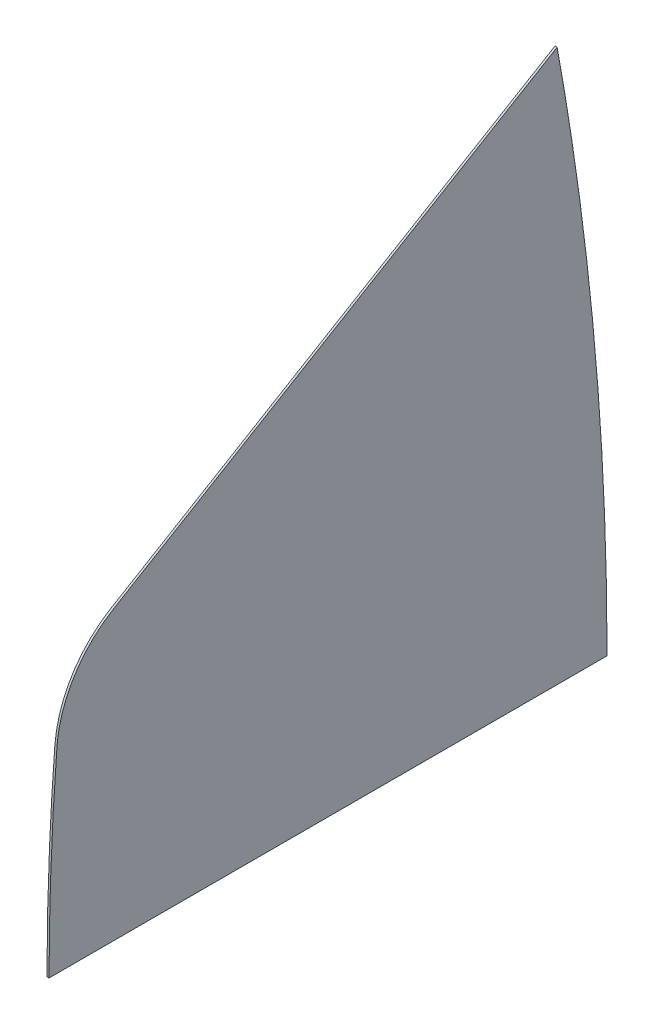
ISO-10303-21;
HEADER;
FILE_DESCRIPTION(('STEP AP214'),'2;1');
FILE_NAME('part.step','',(''),(''),'','','');
FILE_SCHEMA(('AUTOMOTIVE_DESIGN { 1 0 10303 214 1 1 1 1 }'));
ENDSEC;
DATA;
#1=APPLICATION_CONTEXT('core data for automotive mechanical design processes');
#2=APPLICATION_PROTOCOL_DEFINITION('international standard','automotive_design',2000,#1);
#3=PRODUCT_CONTEXT('',#1,'mechanical');
#4=PRODUCT('Part','Part','',(#3));
#5=PRODUCT_RELATED_PRODUCT_CATEGORY('part','',(#4));
#6=PRODUCT_DEFINITION_FORMATION('','',#4);
#7=PRODUCT_DEFINITION_CONTEXT('part definition',#1,'design');
#8=PRODUCT_DEFINITION('design','',#6,#7);
#9=PRODUCT_DEFINITION_SHAPE('','',#8);
#10=(LENGTH_UNIT() NAMED_UNIT(*) SI_UNIT(.MILLI.,.METRE.));
#11=(NAMED_UNIT(*) PLANE_ANGLE_UNIT() SI_UNIT($,.RADIAN.));
#12=(NAMED_UNIT(*) SI_UNIT($,.STERADIAN.) SOLID_ANGLE_UNIT());
#13=UNCERTAINTY_MEASURE_WITH_UNIT(LENGTH_MEASURE(1.E-05),#10,'distance_accuracy_value','');
#14=(GEOMETRIC_REPRESENTATION_CONTEXT(3) GLOBAL_UNCERTAINTY_ASSIGNED_CONTEXT((#13)) GLOBAL_UNIT_ASSIGNED_CONTEXT((#10,
#11,#12)) REPRESENTATION_CONTEXT('',''));
#15=CARTESIAN_POINT('',(0.,0.,0.));
#16=DIRECTION('',(0.,0.,1.));
#17=DIRECTION('',(1.,0.,0.));
#18=AXIS2_PLACEMENT_3D('',#15,#16,#17);
#19=CARTESIAN_POINT('',(-4.15667500419659E-13,-1.81898940354586E-12,0.));
#20=DIRECTION('',(0.,-1.,0.));
#21=DIRECTION('',(0.,0.,-1.));
#22=AXIS2_PLACEMENT_3D('',#19,#20,#21);
#23=PLANE('',#22);
#24=CARTESIAN_POINT('',(0.,0.,2105.25840120506));
#25=CARTESIAN_POINT('',(0.,0.,0.));
#26=(BOUNDED_CURVE() B_SPLINE_CURVE(1,(#24,#25),.UNSPECIFIED.,.F.,
.F.) B_SPLINE_CURVE_WITH_KNOTS((2,2),(-2120.34231948474,-15.0839182796827),
.UNSPECIFIED.) CURVE() GEOMETRIC_REPRESENTATION_ITEM() RATIONAL_B_SPLINE_CURVE((1.,1.)) REPRESENTATION_ITEM(''));
#27=CARTESIAN_POINT('',(4.86810591837638E-12,-9.0949470177293E-13,2105.25840120506));
#28=VERTEX_POINT('',#27);
#29=CARTESIAN_POINT('',(0.,0.,0.));
#30=VERTEX_POINT('',#29);
#31=EDGE_CURVE('E119',#28,#30,#26,.T.);
#32=ORIENTED_EDGE('',*,*,#31,.F.);
#33=CARTESIAN_POINT('',(-8.00000000002688,3.18323145620525E-12,2105.25840120508));
#34=CARTESIAN_POINT('',(0.,0.,2105.25840120506));
#35=(BOUNDED_CURVE() B_SPLINE_CURVE(1,(#33,#34),.UNSPECIFIED.,.F.,
.F.) B_SPLINE_CURVE_WITH_KNOTS((2,2),(-1.,0.),
.UNSPECIFIED.) CURVE() GEOMETRIC_REPRESENTATION_ITEM() RATIONAL_B_SPLINE_CURVE((1.,1.)) REPRESENTATION_ITEM(''));
#36=CARTESIAN_POINT('',(-8.00000000002906,2.27373675443232E-12,2105.25840120508));
#37=VERTEX_POINT('',#36);
#38=EDGE_CURVE('E10',#37,#28,#35,.T.);
#39=ORIENTED_EDGE('',*,*,#38,.F.);
#40=CARTESIAN_POINT('',(-8.00000000002005,3.18323145620525E-12,1.10426112698292E-11));
#41=CARTESIAN_POINT('',(-8.00000000002688,3.18323145620525E-12,2105.25840120508));
#42=(BOUNDED_CURVE() B_SPLINE_CURVE(1,(#40,#41),.UNSPECIFIED.,.F.,
.F.) B_SPLINE_CURVE_WITH_KNOTS((2,2),(15.0839182796827,2120.34231948474),
.UNSPECIFIED.) CURVE() GEOMETRIC_REPRESENTATION_ITEM() RATIONAL_B_SPLINE_CURVE((1.,1.)) REPRESENTATION_ITEM(''));
#43=CARTESIAN_POINT('',(-8.00000000002005,3.18323145620525E-12,1.10426112698292E-11));
#44=VERTEX_POINT('',#43);
#45=EDGE_CURVE('E90',#44,#37,#42,.T.);
#46=ORIENTED_EDGE('',*,*,#45,.F.);
#47=DIRECTION('',(-1.,3.97903932024659E-13,1.38032640872519E-12));
#48=VECTOR('',#47,1.);
#49=CARTESIAN_POINT('',(-4.00000000001002,1.59161572810263E-12,5.5213056349146E-12));
#50=LINE('',#49,#48);
#51=EDGE_CURVE('E67',#30,#44,#50,.T.);
#52=ORIENTED_EDGE('',*,*,#51,.F.);
#53=EDGE_LOOP('',(#32,#39,#46,#52));
#54=FACE_BOUND('',#53,.T.);
#55=ADVANCED_FACE('F16',(#54),#23,.T.);
#56=CARTESIAN_POINT('',(0.,-1.81898940354586E-12,2105.25840120506));
#57=CARTESIAN_POINT('',(-8.00000000002729,1.36424205265939E-12,2105.25840120508));
#58=CARTESIAN_POINT('',(3.26849658449646E-13,247.452900952764,2105.15515744929));
#59=CARTESIAN_POINT('',(-8.00000000003119,247.452900952755,2105.1551574493));
#60=CARTESIAN_POINT('',(-1.98951966012828E-13,494.858716043923,2095.21803900071));
#61=CARTESIAN_POINT('',(-8.00000000003103,494.858716043934,2095.21803900071));
#62=CARTESIAN_POINT('',(3.74811293113453E-13,741.63099538606,2075.4575480513));
#63=CARTESIAN_POINT('',(-8.00000000002858,741.630995386065,2075.45754805132));
#64=CARTESIAN_POINT('',(1.24344978758018E-13,775.896176998787,2072.7137534174));
#65=CARTESIAN_POINT('',(-8.00000000003404,775.896176998781,2072.71375341741));
#66=CARTESIAN_POINT('',(2.06057393370429E-13,809.834151180558,2065.95534073106));
#67=CARTESIAN_POINT('',(-8.00000000002793,809.83415118057,2065.95534073108));
#68=CARTESIAN_POINT('',(3.05533376376843E-13,842.729808078358,2055.24603988153));
#69=CARTESIAN_POINT('',(-8.00000000002987,842.729808078363,2055.24603988155));
#70=CARTESIAN_POINT('',(3.48165940522449E-13,859.477529499785,2049.79375820789));
#71=CARTESIAN_POINT('',(-8.00000000003063,859.477529438666,2049.79375822866));
#72=CARTESIAN_POINT('',(0.,875.932419384229,2043.32468240479));
#73=CARTESIAN_POINT('',(-8.00000000003081,875.932419353489,2043.32468242));
#74=CARTESIAN_POINT('',(5.08038056068472E-13,891.997989503351,2035.8566204281));
#75=CARTESIAN_POINT('',(-8.00000000003153,891.997989503363,2035.85662042811));
#76=CARTESIAN_POINT('',(0.,908.074008811072,2028.38370115798));
#77=CARTESIAN_POINT('',(-8.00000000003352,908.074008860786,2028.38370112981));
#78=CARTESIAN_POINT('',(0.,923.743471132829,2019.91822990809));
#79=CARTESIAN_POINT('',(-8.00000000002764,923.743471033434,2019.91822996451));
#80=CARTESIAN_POINT('',(2.16715534406831E-13,938.908350284025,2010.4860880126));
#81=CARTESIAN_POINT('',(-8.00000000003154,938.908350284038,2010.48608801263));
#82=CARTESIAN_POINT('',(0.,953.952906758594,2001.12878354561));
#83=CARTESIAN_POINT('',(-8.00000000002682,953.952906758614,2001.12878354565));
#84=CARTESIAN_POINT('',(2.8421709430404E-13,968.482638028346,1990.83136278576));
#85=CARTESIAN_POINT('',(-8.00000000003134,968.482638028377,1990.83136278578));
#86=CARTESIAN_POINT('',(0.,982.401314617929,1979.62858234086));
#87=CARTESIAN_POINT('',(-8.00000000003049,982.401314617953,1979.62858234089));
#88=CARTESIAN_POINT('',(1.84741111297626E-13,996.097575264539,1968.60481869836));
#89=CARTESIAN_POINT('',(-8.00000000002989,996.097575315775,1968.60481864994));
#90=CARTESIAN_POINT('',(2.77111666946439E-13,1009.18289712888,1956.71983361948));
#91=CARTESIAN_POINT('',(-8.00000000003179,1009.1828970265,1956.71983371639));
#92=CARTESIAN_POINT('',(0.,1021.5666033896,1944.01731140958));
#93=CARTESIAN_POINT('',(-8.00000000003068,1021.56660338963,1944.01731140961));
#94=CARTESIAN_POINT('',(3.48165940522449E-13,1045.41898726154,1919.55085286211));
#95=CARTESIAN_POINT('',(-8.00000000002978,1045.41898726157,1919.55085286212));
#96=CARTESIAN_POINT('',(2.77111666946439E-13,1066.55422213134,1892.16745836807));
#97=CARTESIAN_POINT('',(-8.00000000003376,1066.55422213136,1892.16745836809));
#98=CARTESIAN_POINT('',(-1.63424829224823E-13,1084.3680953132,1862.30488629375));
#99=CARTESIAN_POINT('',(-8.00000000003037,1084.36809531324,1862.30488629376));
#100=CARTESIAN_POINT('',(-3.90798504668055E-13,1417.22497501416,1304.31441402036));
#101=CARTESIAN_POINT('',(-8.00000000002692,1417.2249750142,1304.31441402039));
#102=CARTESIAN_POINT('',(-2.02504679691629E-13,1750.08185471511,746.323941746978));
#103=CARTESIAN_POINT('',(-8.00000000002973,1750.08185471513,746.323941746997));
#104=CARTESIAN_POINT('',(0.,2082.93873441606,188.333469473596));
#105=CARTESIAN_POINT('',(-8.00000000002873,2082.93873441609,188.333469473608));
#106=B_SPLINE_SURFACE_WITH_KNOTS('',3,1,((#56,#57),(#58,#59),(#60,#61),(#62,#63),(#64,#65),(#66,
#67),(#68,#69),(#70,#71),(#72,#73),(#74,#75),(#76,#77),(#78,#79),(#80,#81),(#82,#83),(#84,#85),
(#86,#87),(#88,#89),(#90,#91),(#92,#93),(#94,#95),(#96,#97),(#98,#99),(#100,#101),(#102,#103),
(#104,#105)),.UNSPECIFIED.,.F.,.F.,.F.,(4,2,1,2,1,2,1,2,1,2,1,2,1,2,1,4),(2,2),
(-3076.99961647915,-2390.84743342106,-2390.84732984685,-2287.27322299327,-2287.27316998304,
-2234.26299359608,-2234.26294019919,-2180.86610504609,-2180.86605165316,-2127.47318000541,
-2127.47312700673,-2074.47449503824,-2074.47439150558,-1970.94183671468,-1970.9398875293,
-21.756461844165),(0.,1.),.UNSPECIFIED.);
#107=CARTESIAN_POINT('',(1.0262901486001E-11,741.630995386061,2075.4575480513));
#108=CARTESIAN_POINT('',(1.47494494694273E-11,736.314681896155,2075.88325626813));
#109=CARTESIAN_POINT('',(1.79105715435892E-11,730.997997919161,2076.30441130693));
#110=CARTESIAN_POINT('',(2.87570090802597E-11,704.41265734064,2078.38742613175));
#111=CARTESIAN_POINT('',(2.15644881510324E-11,683.138589687673,2079.98097649949));
#112=CARTESIAN_POINT('',(1.89955705465223E-11,651.219813819813,2082.26193365953));
#113=CARTESIAN_POINT('',(1.95092318002942E-11,640.578966227686,2083.00402313466));
#114=CARTESIAN_POINT('',(2.02873570401422E-11,608.652562863898,2085.175609344));
#115=CARTESIAN_POINT('',(1.97889512664422E-11,587.363240151922,2086.55041684748));
#116=CARTESIAN_POINT('',(1.95869014005515E-11,555.422706204088,2088.50318660989));
#117=CARTESIAN_POINT('',(1.96104772587693E-11,544.774793351044,2089.13586834315));
#118=CARTESIAN_POINT('',(1.96374245356251E-11,512.827756455389,2090.97919455822));
#119=CARTESIAN_POINT('',(1.95970150634719E-11,491.525427790416,2092.1351140035));
#120=CARTESIAN_POINT('',(1.95795637305687E-11,459.566510051935,2093.75949019924));
#121=CARTESIAN_POINT('',(1.95809403816259E-11,448.912656803635,2094.28269740474));
#122=CARTESIAN_POINT('',(1.9585275414481E-11,416.948361492417,2095.79756905645));
#123=CARTESIAN_POINT('',(1.9588438865648E-11,395.635277634469,2096.73447844962));
#124=CARTESIAN_POINT('',(1.95985931262191E-11,363.6613518224,2098.03028968259));
#125=CARTESIAN_POINT('',(1.96028793783265E-11,353.002683344882,2098.44396716086));
#126=CARTESIAN_POINT('',(1.96161896012209E-11,321.024508045617,2099.63022439498));
#127=CARTESIAN_POINT('',(1.96256650048191E-11,299.702925175712,2100.34802482596));
#128=CARTESIAN_POINT('',(1.96376359835248E-11,267.71736066203,2101.31513453357));
#129=CARTESIAN_POINT('',(1.96412526164853E-11,257.054997593575,2101.61923873091));
#130=CARTESIAN_POINT('',(1.96470581288287E-11,235.729291927085,2102.19091525536));
#131=CARTESIAN_POINT('',(1.96492470082114E-11,225.06594932905,2102.45848758246));
#132=CARTESIAN_POINT('',(1.96527667563817E-11,193.0745095982,2103.20640446073));
#133=CARTESIAN_POINT('',(1.96510506890963E-11,171.745094394914,2103.6319460707));
#134=CARTESIAN_POINT('',(1.96386607729005E-11,139.749287690777,2104.16063444145));
#135=CARTESIAN_POINT('',(1.96328948551164E-11,129.083761615715,2104.3185929973));
#136=CARTESIAN_POINT('',(1.96109169940846E-11,98.6831829301917,2104.71674350199));
#137=CARTESIAN_POINT('',(1.95899916168063E-11,78.9475285443731,2104.91265423854));
#138=CARTESIAN_POINT('',(1.95309045444476E-11,39.4745812213429,2105.17936878237));
#139=CARTESIAN_POINT('',(1.9492742156685E-11,19.7372882501556,2105.25016756138));
#140=CARTESIAN_POINT('',(1.94440019640751E-11,-1.81898940354586E-12,2105.25840120506));
#141=B_SPLINE_CURVE_WITH_KNOTS('',3,(#107,#108,#109,#110,#111,#112,#113,#114,#115,#116,#117,
#118,#119,#120,#121,#122,#123,#124,#125,#126,#127,#128,#129,#130,#131,#132,#133,#134,#135,#136,
#137,#138,#139,#140),.UNSPECIFIED.,.F.,.F.,(4,2,2,2,2,2,2,2,2,2,2,2,2,2,2,2,4),(0.,
16.0000058651861,80.0003814943702,112.000428447405,176.000804076584,208.000851029592,
272.001226658452,304.001273611407,368.001649239799,400.001696192695,464.002071820629,
496.002118773474,528.002165726305,592.002541353816,624.002588306623,683.212041117407,
742.423873516193),.UNSPECIFIED.);
#142=CARTESIAN_POINT('',(1.0262901486001E-11,741.630995386061,2075.4575480513));
#143=VERTEX_POINT('',#142);
#144=EDGE_CURVE('E158',#143,#28,#141,.T.);
#145=CARTESIAN_POINT('',(9.45555102843074E-12,1084.36809531314,1862.30488629371));
#146=CARTESIAN_POINT('',(-2.85879483248005E-11,1083.00194296951,1864.59506594582));
#147=CARTESIAN_POINT('',(-2.9634373355415E-11,1081.61499691188,1866.8727713385));
#148=CARTESIAN_POINT('',(-9.16380651294026E-12,1078.79928633017,1871.40359248344));
#149=CARTESIAN_POINT('',(1.23632378528436E-11,1077.37050345073,1873.65669682862));
#150=CARTESIAN_POINT('',(3.35999462649664E-11,1073.01403925301,1880.39030838118));
#151=CARTESIAN_POINT('',(-1.04325966138347E-11,1070.02461014265,1884.83108475072));
#152=CARTESIAN_POINT('',(-2.83712666196332E-11,1063.88533983922,1893.60101441637));
#153=CARTESIAN_POINT('',(-2.26860116062085E-12,1060.73547858195,1897.93015364825));
#154=CARTESIAN_POINT('',(-3.65325664118523E-11,1054.28014278857,1906.47018624175));
#155=CARTESIAN_POINT('',(-9.68912673373112E-11,1050.97468255008,1910.68109041116));
#156=CARTESIAN_POINT('',(5.80786198309926E-11,1044.21263649073,1918.9790322758));
#157=CARTESIAN_POINT('',(2.7337195651757E-10,1040.75607004849,1923.06608574109));
#158=CARTESIAN_POINT('',(-1.06734473582973E-10,1035.46685089256,1929.09350263739));
#159=CARTESIAN_POINT('',(-3.49687265270488E-10,1033.6892361965,1931.08242572242));
#160=CARTESIAN_POINT('',(3.10835682446864E-10,1030.09835505046,1935.02735465545));
#161=CARTESIAN_POINT('',(1.21414188864366E-09,1028.28509391168,1936.98336532789));
#162=CARTESIAN_POINT('',(-5.77801080199437E-10,1025.53889358696,1939.89224546587));
#163=CARTESIAN_POINT('',(-1.69943403640951E-09,1024.61916585833,1940.85762449646));
#164=CARTESIAN_POINT('',(8.7878579286135E-10,1023.23302242804,1942.29938634344));
#165=CARTESIAN_POINT('',(2.44828960501015E-09,1022.76988445301,1942.77892066268));
#166=CARTESIAN_POINT('',(-1.19513236719445E-09,1022.07354654455,1943.49663809792));
#167=CARTESIAN_POINT('',(-3.40921425425573E-09,1021.84116231008,1943.7356130049));
#168=CARTESIAN_POINT('',(1.26459023932546E-10,1021.60123627093,1943.98178308248));
#169=CARTESIAN_POINT('',(2.39110929105885E-10,1021.59396552448,1943.98924251881));
#170=CARTESIAN_POINT('',(-9.05803208664024E-11,1021.58305900733,1944.00043128588));
#171=CARTESIAN_POINT('',(-2.8358892203863E-10,1021.57942343536,1944.00416081033));
#172=CARTESIAN_POINT('',(-1.19618387743485E-10,1021.57396997803,1944.00975500012));
#173=CARTESIAN_POINT('',(1.061902968017E-11,1021.57215214235,1944.0116197139));
#174=CARTESIAN_POINT('',(2.36648249385775E-11,1021.56942536403,1944.01441676039));
#175=CARTESIAN_POINT('',(-2.37163178322959E-12,1021.56851643379,1944.01534910518));
#176=CARTESIAN_POINT('',(2.74490506377472E-11,1021.56726664897,1944.0166310737));
#177=CARTESIAN_POINT('',(4.22931835108157E-11,1021.56692579797,1944.0169807009));
#178=CARTESIAN_POINT('',(-1.13199986864706E-11,1021.5661304777,1944.01779649646));
#179=CARTESIAN_POINT('',(-1.09193809604252E-10,1021.56567600799,1944.01826266438));
#180=CARTESIAN_POINT('',(-4.34581566662118E-10,1021.56340365423,1944.02059349893));
#181=CARTESIAN_POINT('',(-1.70151620684114E-10,1021.56158575458,1944.02245815034));
#182=CARTESIAN_POINT('',(7.77188769041192E-10,1021.5524961736,1944.03178132676));
#183=CARTESIAN_POINT('',(3.35671189470928E-10,1021.54522424404,1944.03923960976));
#184=CARTESIAN_POINT('',(-1.24609685845479E-09,1021.50886327141,1944.07652973348));
#185=CARTESIAN_POINT('',(-5.08887703217508E-10,1021.4797702547,1944.10635769959));
#186=CARTESIAN_POINT('',(2.13216146154756E-09,1021.3342839668,1944.25547688005));
#187=CARTESIAN_POINT('',(9.01009664786294E-10,1021.21782713556,1944.37470609));
#188=CARTESIAN_POINT('',(-3.50734855490771E-09,1020.63520321007,1944.97052223202));
#189=CARTESIAN_POINT('',(-1.44229997018562E-09,1020.16802018973,1945.44611597221));
#190=CARTESIAN_POINT('',(5.86645710542985E-09,1017.82663515344,1947.81884017442));
#191=CARTESIAN_POINT('',(2.05927977854961E-09,1015.93623980109,1949.70001509931));
#192=CARTESIAN_POINT('',(-4.0627886908048E-09,1010.21122414057,1955.29440774181));
#193=CARTESIAN_POINT('',(-1.06458449296185E-09,1006.32552591635,1958.95560142581));
#194=CARTESIAN_POINT('',(1.02586396001627E-09,998.423240439252,1966.13434912675));
#195=CARTESIAN_POINT('',(1.17800984626969E-10,994.406642915712,1969.65189182347));
#196=CARTESIAN_POINT('',(-4.70038378373468E-10,986.248401895407,1976.53820258331));
#197=CARTESIAN_POINT('',(-1.49916141509712E-10,982.10676874719,1979.90698290219));
#198=CARTESIAN_POINT('',(1.11124664750158E-10,973.703295764445,1986.4918704095));
#199=CARTESIAN_POINT('',(5.20105105088575E-11,969.441445588192,1989.70796439878));
#200=CARTESIAN_POINT('',(-1.2783726017135E-11,960.79318289301,1995.99042824442));
#201=CARTESIAN_POINT('',(-1.83355903839107E-11,956.406496679034,1999.05642135826));
#202=CARTESIAN_POINT('',(-2.04672253683996E-11,947.523878295462,2005.02655820764));
#203=CARTESIAN_POINT('',(-1.70463481450081E-11,943.027938260848,2007.93069024119));
#204=CARTESIAN_POINT('',(-2.17572830294017E-11,933.931382533198,2013.57407101274));
#205=CARTESIAN_POINT('',(-2.98934732219596E-11,929.330727821564,2016.31325685548));
#206=CARTESIAN_POINT('',(-8.90953746558723E-12,920.032629056381,2021.62183794983));
#207=CARTESIAN_POINT('',(2.0209623045286E-11,915.335187514078,2024.19123759948));
#208=CARTESIAN_POINT('',(1.90802033071478E-11,905.84929375502,2029.1571051283));
#209=CARTESIAN_POINT('',(-1.11734826100858E-11,901.060833746351,2031.55355811685));
#210=CARTESIAN_POINT('',(-2.76292438599101E-11,891.399532841877,2036.17015758081));
#211=CARTESIAN_POINT('',(-1.38313852057779E-11,886.526692072529,2038.39030432043));
#212=CARTESIAN_POINT('',(-2.21851621410544E-11,879.160490224581,2041.58544749317));
#213=CARTESIAN_POINT('',(-2.98067461145886E-11,876.696136601445,2042.62777235075));
#214=CARTESIAN_POINT('',(-8.99644957328329E-12,871.748947090922,2044.66724994411));
#215=CARTESIAN_POINT('',(1.9433847890476E-11,869.26611201982,2045.66440466134));
#216=CARTESIAN_POINT('',(-9.70620755344145E-11,861.791329016926,2048.58752368056));
#217=CARTESIAN_POINT('',(-4.43717443306224E-10,856.772488069559,2050.44540970143));
#218=CARTESIAN_POINT('',(2.51147653223699E-10,849.204268900316,2053.0911144242));
#219=CARTESIAN_POINT('',(6.83617354541409E-10,846.678865602243,2053.94825965614));
#220=CARTESIAN_POINT('',(-6.29283353189572E-11,843.829282571137,2054.88663580655));
#221=CARTESIAN_POINT('',(-1.62999540071334E-10,843.512555397552,2054.99053624941));
#222=CARTESIAN_POINT('',(6.57681660378889E-11,843.116499411611,2055.11996173212));
#223=CARTESIAN_POINT('',(1.29214500675758E-10,843.037280899441,2055.1458243134));
#224=CARTESIAN_POINT('',(-3.45869097052426E-11,842.918442122651,2055.18458442542));
#225=CARTESIAN_POINT('',(-1.3234919511693E-10,842.878827362898,2055.19749883592));
#226=CARTESIAN_POINT('',(9.61940732609993E-11,842.819402473133,2055.21686201091));
#227=CARTESIAN_POINT('',(2.34906277568501E-10,842.799593718264,2055.22331499575));
#228=CARTESIAN_POINT('',(-8.74341055005213E-11,842.769879898719,2055.23299236277));
#229=CARTESIAN_POINT('',(-2.83282347674832E-10,842.759975177673,2055.23621780007));
#230=CARTESIAN_POINT('',(-1.23946836349053E-10,842.745117924314,2055.24105542841));
#231=CARTESIAN_POINT('',(4.68297977299765E-12,842.740165477897,2055.24266788325));
#232=CARTESIAN_POINT('',(2.38448346164136E-11,842.733974884105,2055.24468334193));
#233=CARTESIAN_POINT('',(2.05959348210772E-11,842.732736763558,2055.24508642817));
#234=CARTESIAN_POINT('',(1.9793635983632E-11,842.731034345338,2055.24564066417));
#235=CARTESIAN_POINT('',(1.99496504532573E-11,842.730570049208,2055.24579181867));
#236=CARTESIAN_POINT('',(2.00778410168244E-11,842.729622110773,2055.24610042423));
#237=CARTESIAN_POINT('',(2.00420863203723E-11,842.729138468448,2055.24625787522));
#238=CARTESIAN_POINT('',(1.99365068928928E-11,842.727416700796,2055.24681839777));
#239=CARTESIAN_POINT('',(1.99005455375924E-11,842.726178573954,2055.24722146468));
#240=CARTESIAN_POINT('',(2.04598514181382E-11,842.719987930797,2055.24923677172));
#241=CARTESIAN_POINT('',(2.3272456625757E-11,842.715035387648,2055.25084892944));
#242=CARTESIAN_POINT('',(6.97175776583927E-12,842.690272528758,2055.2589092784));
#243=CARTESIAN_POINT('',(-1.03232721359448E-10,842.670461783712,2055.26535615078));
#244=CARTESIAN_POINT('',(-4.72348911739296E-10,842.571405766861,2055.29758347949));
#245=CARTESIAN_POINT('',(-1.8554192971376E-10,842.492153629185,2055.32334283316));
#246=CARTESIAN_POINT('',(8.4222082031707E-10,842.095856183865,2055.45202709774));
#247=CARTESIAN_POINT('',(3.64357041897291E-10,841.778701180816,2055.55461430996));
#248=CARTESIAN_POINT('',(-1.35741756963668E-09,840.192332643325,2056.06575206697));
#249=CARTESIAN_POINT('',(-5.98614179310257E-10,838.921375371701,2056.4688957096));
#250=CARTESIAN_POINT('',(6.66391640940198E-10,835.102744623178,2057.66107759973));
#251=CARTESIAN_POINT('',(1.60750641048468E-10,832.549626074924,2058.43276252233));
#252=CARTESIAN_POINT('',(-1.99579449408278E-10,827.429458132006,2059.92967977838));
#253=CARTESIAN_POINT('',(-5.41743309921695E-11,824.862406774891,2060.65490537359));
#254=CARTESIAN_POINT('',(1.68506868232336E-10,817.125952970014,2062.76477619779));
#255=CARTESIAN_POINT('',(3.00166960660189E-11,811.937054030146,2064.07868078789));
#256=CARTESIAN_POINT('',(-6.88257107251148E-11,801.514248067699,2066.51645801602));
#257=CARTESIAN_POINT('',(-2.91553204457085E-11,796.280335412995,2067.64030649971));
#258=CARTESIAN_POINT('',(-9.64630677368728E-12,785.774391658284,2069.69644546166));
#259=CARTESIAN_POINT('',(-2.98145024483628E-11,780.502356282195,2070.62871409497));
#260=CARTESIAN_POINT('',(-8.98950178193667E-12,769.928319744895,2072.30019687843));
#261=CARTESIAN_POINT('',(3.19962623689254E-11,764.626322303057,2073.03943447527));
#262=CARTESIAN_POINT('',(1.32785411994898E-11,756.37147811476,2074.03723411869));
#263=CARTESIAN_POINT('',(-9.64206761995738E-12,753.426610098025,2074.36305253148));
#264=CARTESIAN_POINT('',(-2.91559903345757E-11,747.532308637776,2074.95500920542));
#265=CARTESIAN_POINT('',(-2.57619262942965E-11,744.582878061424,2075.22117601595));
#266=CARTESIAN_POINT('',(2.01509917813135E-11,741.630995385655,2075.45754805134));
#267=B_SPLINE_CURVE_WITH_KNOTS('',3,(#145,#146,#147,#148,#149,#150,#151,#152,#153,#154,#155,
#156,#157,#158,#159,#160,#161,#162,#163,#164,#165,#166,#167,#168,#169,#170,#171,#172,#173,#174,
#175,#176,#177,#178,#179,#180,#181,#182,#183,#184,#185,#186,#187,#188,#189,#190,#191,#192,#193,
#194,#195,#196,#197,#198,#199,#200,#201,#202,#203,#204,#205,#206,#207,#208,#209,#210,#211,#212,
#213,#214,#215,#216,#217,#218,#219,#220,#221,#222,#223,#224,#225,#226,#227,#228,#229,#230,#231,
#232,#233,#234,#235,#236,#237,#238,#239,#240,#241,#242,#243,#244,#245,#246,#247,#248,#249,#250,
#251,#252,#253,#254,#255,#256,#257,#258,#259,#260,#261,#262,#263,#264,#265,#266),.UNSPECIFIED.,
.F.,.F.,(4,2,2,2,2,2,2,2,2,2,2,2,2,2,2,2,2,2,2,2,2,2,2,2,2,2,2,2,2,2,2,2,2,2,2,2,2,2,2,2,2,2,2,
2,2,2,2,2,2,2,2,2,2,2,2,2,2,2,2,2,4),(0.,7.99987253880648,16.0033091210846,32.0591587179301,
48.1170212698739,64.1734111728535,80.2277479300866,88.2299941560879,96.2310569773185,
100.231098325396,102.231103494273,103.231104140417,103.262354140437,103.27797914044,
103.28579164044,103.28969789044,103.291162734209,103.29311585921,103.30092835921,
103.33217835923,103.457178360492,103.957178441232,105.95718360858,113.957514370234,
129.970144189901,145.984033436632,161.99660091081,178.010550099696,194.062824147878,
210.116257218539,226.175773323523,242.234873269386,258.295354251093,274.355811165438,
282.382581407307,290.408999203012,306.459824130388,314.460154719654,315.460155365258,
315.710155375347,315.835155376609,315.897655376767,315.928905376786,315.944530376789,
315.948436626789,315.949901470539,315.951427349442,315.955333599442,315.970958599445,
316.033458599603,316.28345860969,317.283459255184,321.283500569112,329.284575254425,
337.286807764709,353.34091067454,369.397052379073,385.45502387477,401.511043964886,
410.399017888866,419.282728881732),.UNSPECIFIED.);
#268=CARTESIAN_POINT('',(9.45555102843074E-12,1084.36809531314,1862.30488629371));
#269=VERTEX_POINT('',#268);
#270=EDGE_CURVE('E37',#269,#143,#267,.T.);
#271=DIRECTION('',(0.,-0.512301524512095,0.85880565204392));
#272=VECTOR('',#271,1.);
#273=CARTESIAN_POINT('',(-1.94013693999295E-11,2082.93873441606,188.333469473596));
#274=LINE('',#273,#272);
#275=CARTESIAN_POINT('',(-9.70423741364355E-12,2082.93873441606,188.333469473596));
#276=VERTEX_POINT('',#275);
#277=EDGE_CURVE('E22',#276,#269,#274,.T.);
#278=CARTESIAN_POINT('',(0.,2082.93873441606,188.333469473596));
#279=CARTESIAN_POINT('',(-8.00000000002905,2082.93873441609,188.333469473604));
#280=(BOUNDED_CURVE() B_SPLINE_CURVE(1,(#278,#279),.UNSPECIFIED.,.F.,
.F.) B_SPLINE_CURVE_WITH_KNOTS((2,2),(0.,1.),
.UNSPECIFIED.) CURVE() GEOMETRIC_REPRESENTATION_ITEM() RATIONAL_B_SPLINE_CURVE((1.,1.)) REPRESENTATION_ITEM(''));
#281=CARTESIAN_POINT('',(-8.00000000002905,2082.93873441609,188.333469473604));
#282=VERTEX_POINT('',#281);
#283=EDGE_CURVE('E29',#276,#282,#280,.T.);
#284=DIRECTION('',(0.,0.512301524512095,-0.85880565204392));
#285=VECTOR('',#284,1.);
#286=CARTESIAN_POINT('',(-8.00000000001938,1084.36809531324,1862.30488629376));
#287=LINE('',#286,#285);
#288=CARTESIAN_POINT('',(-8.00000000003586,1084.36809531317,1862.30488629372));
#289=VERTEX_POINT('',#288);
#290=EDGE_CURVE('E98',#289,#282,#287,.T.);
#291=CARTESIAN_POINT('',(-8.00000000003318,741.630995386066,2075.45754805132));
#292=CARTESIAN_POINT('',(-8.00000000001352,744.289635418737,2075.24465639558));
#293=CARTESIAN_POINT('',(-8.00000000001347,746.946278973998,2075.00759796084));
#294=CARTESIAN_POINT('',(-8.00000000002529,752.255106085203,2074.48519235494));
#295=CARTESIAN_POINT('',(-8.00000000003716,754.907289124101,2074.19983992944));
#296=CARTESIAN_POINT('',(-8.00000000004973,762.87038084379,2073.26975749913));
#297=CARTESIAN_POINT('',(-8.00000000002719,768.172968519328,2072.55219190336));
#298=CARTESIAN_POINT('',(-8.00000000001157,778.748689165453,2070.92415396594));
#299=CARTESIAN_POINT('',(-8.00000000001849,784.021820034894,2070.0136680392));
#300=CARTESIAN_POINT('',(-8.00000000002027,794.535274943497,2068.00026283031));
#301=CARTESIAN_POINT('',(-8.00000000001512,799.775572175005,2066.89720332768));
#302=CARTESIAN_POINT('',(-8.00000000002364,810.212911814114,2064.5004733204));
#303=CARTESIAN_POINT('',(-8.0000000000373,815.40994925343,2063.20678123263));
#304=CARTESIAN_POINT('',(-8.00000000004301,827.543624069777,2059.95002140985));
#305=CARTESIAN_POINT('',(-8.00000000002593,834.459823323634,2057.91024616969));
#306=CARTESIAN_POINT('',(-8.00000000001283,848.185635643477,2053.49276556197));
#307=CARTESIAN_POINT('',(-8.00000000001681,854.995214918569,2051.11495537544));
#308=CARTESIAN_POINT('',(-8.00000000002195,868.48980210446,2046.02738839882));
#309=CARTESIAN_POINT('',(-8.0000000000231,875.174801443817,2043.31760886477));
#310=CARTESIAN_POINT('',(-8.00000000001566,888.412591569281,2037.56884812182));
#311=CARTESIAN_POINT('',(-8.00000000000705,894.965188970224,2034.52942160754));
#312=CARTESIAN_POINT('',(-8.00000000003171,907.912431341659,2028.13198722104));
#313=CARTESIAN_POINT('',(-8.00000000006497,914.307086293206,2024.77399954532));
#314=CARTESIAN_POINT('',(-7.99999999997379,926.923684921277,2017.74721407832));
#315=CARTESIAN_POINT('',(-7.99999999984935,933.145622668334,2014.0784056339));
#316=CARTESIAN_POINT('',(-7.99999999987018,944.524390838169,2006.98569915214));
#317=CARTESIAN_POINT('',(-7.99999999997942,949.706247816874,2003.60186023377));
#318=CARTESIAN_POINT('',(-8.00000000005934,959.923262994748,1996.61819673641));
#319=CARTESIAN_POINT('',(-8.00000000003002,964.958404527345,1993.01834776011));
#320=CARTESIAN_POINT('',(-8.00000000000874,974.872859689961,1985.6090545326));
#321=CARTESIAN_POINT('',(-8.0000000000168,979.752156496414,1981.79958777303));
#322=CARTESIAN_POINT('',(-8.00000000002196,989.346182500255,1973.97777756267));
#323=CARTESIAN_POINT('',(-8.00000000001907,994.060894642551,1969.96541319147));
#324=CARTESIAN_POINT('',(-8.00000000001969,1003.31226198944,1961.74935855731));
#325=CARTESIAN_POINT('',(-8.00000000002321,1007.8490875886,1957.54586015084));
#326=CARTESIAN_POINT('',(-8.00000000001556,1016.74128300219,1948.95155739411));
#327=CARTESIAN_POINT('',(-8.00000000000439,1021.09666219929,1944.56076275285));
#328=CARTESIAN_POINT('',(-8.00000000003437,1029.61747065411,1935.60049760878));
#329=CARTESIAN_POINT('',(-8.0000000000755,1033.78294169414,1931.03106682325));
#330=CARTESIAN_POINT('',(-7.99999999996329,1041.91613243405,1921.72239662815));
#331=CARTESIAN_POINT('',(-7.99999999981003,1045.88392918713,1916.98322464153));
#332=CARTESIAN_POINT('',(-7.99999999989403,1051.8637590979,1909.52720239022));
#333=CARTESIAN_POINT('',(-7.99999999998579,1053.94715998463,1906.86726769759));
#334=CARTESIAN_POINT('',(-8.00000000005297,1058.05174188693,1901.50060602287));
#335=CARTESIAN_POINT('',(-8.00000000002842,1060.07293550647,1898.79388869541));
#336=CARTESIAN_POINT('',(-8.00000000001034,1064.05221889987,1893.33489959086));
#337=CARTESIAN_POINT('',(-8.00000000001681,1066.01031507998,1890.58263248165));
#338=CARTESIAN_POINT('',(-8.00000000002195,1069.85895754163,1885.03895276289));
#339=CARTESIAN_POINT('',(-8.00000000002064,1071.74962425984,1882.24762377363));
#340=CARTESIAN_POINT('',(-8.00000000001812,1075.46646299771,1876.62195018349));
#341=CARTESIAN_POINT('',(-8.00000000001692,1077.29262852384,1873.78760129251));
#342=CARTESIAN_POINT('',(-8.00000000002184,1080.87967416414,1868.07709341005));
#343=CARTESIAN_POINT('',(-8.00000000002796,1082.64054106726,1865.20092612009));
#344=CARTESIAN_POINT('',(-8.00000000004136,1084.36809531317,1862.30488629373));
#345=B_SPLINE_CURVE_WITH_KNOTS('',3,(#291,#292,#293,#294,#295,#296,#297,#298,#299,#300,#301,
#302,#303,#304,#305,#306,#307,#308,#309,#310,#311,#312,#313,#314,#315,#316,#317,#318,#319,#320,
#321,#322,#323,#324,#325,#326,#327,#328,#329,#330,#331,#332,#333,#334,#335,#336,#337,#338,#339,
#340,#341,#342,#343,#344),.UNSPECIFIED.,.F.,.F.,(4,2,2,2,2,2,2,2,2,2,2,2,2,2,2,2,2,2,2,2,2,2,2,
2,2,2,4),(0.,8.00121789493779,16.003306878221,32.0521914043726,48.1022064393467,
64.1639572463015,80.2275279381094,101.850574553961,123.480340798494,145.111589776567,
166.772432228417,188.431902319156,210.092115073114,228.653360297039,247.216705884335,
265.782048673201,284.349309619694,302.898327707164,321.446385421754,339.990342426704,
358.527013537144,368.662440447924,378.795800090827,388.928127634983,399.041345188003,
409.155577983643,419.271846020316),.UNSPECIFIED.);
#346=CARTESIAN_POINT('',(-8.00000000003318,741.630995386066,2075.45754805132));
#347=VERTEX_POINT('',#346);
#348=EDGE_CURVE('E78',#347,#289,#345,.T.);
#349=CARTESIAN_POINT('',(-8.00000000003125,1.36424205265939E-12,2105.25840120508));
#350=CARTESIAN_POINT('',(-8.00000000003391,5.33333653627741,2105.25617599548));
#351=CARTESIAN_POINT('',(-8.00000000003513,10.666669578627,2105.24938266263));
#352=CARTESIAN_POINT('',(-8.00000000003625,21.3333162006314,2105.22665976535));
#353=CARTESIAN_POINT('',(-8.00000000003615,26.6666297802862,2105.21073020091));
#354=CARTESIAN_POINT('',(-8.0000000000362,42.6665343510442,2105.14923713741));
#355=CARTESIAN_POINT('',(-8.00000000003671,53.3330774357019,2105.08996927306));
#356=CARTESIAN_POINT('',(-8.0000000000372,69.3326759723189,2104.97365946705));
#357=CARTESIAN_POINT('',(-8.00000000003732,74.6658365350715,2104.93032156152));
#358=CARTESIAN_POINT('',(-8.00000000003769,90.6652126589992,2104.78660383821));
#359=CARTESIAN_POINT('',(-8.00000000003795,101.331310917789,2104.67252007893));
#360=CARTESIAN_POINT('',(-8.00000000003831,117.330100662793,2104.47398790501));
#361=CARTESIAN_POINT('',(-8.00000000003842,122.662968036407,2104.40324280433));
#362=CARTESIAN_POINT('',(-8.00000000003875,138.66139421165,2104.17730421908));
#363=CARTESIAN_POINT('',(-8.00000000003896,149.326765330117,2104.00840757686));
#364=CARTESIAN_POINT('',(-8.00000000003925,165.324323611528,2103.7276582727));
#365=CARTESIAN_POINT('',(-8.00000000003934,170.656757038703,2103.62950784272));
#366=CARTESIAN_POINT('',(-8.0000000000396,186.653810602962,2103.32135436409));
#367=CARTESIAN_POINT('',(-8.00000000003977,197.31817228601,2103.09764931259));
#368=CARTESIAN_POINT('',(-8.00000000004,213.314077649298,2102.73469025283));
#369=CARTESIAN_POINT('',(-8.00000000004007,218.645936976619,2102.60913706245));
#370=CARTESIAN_POINT('',(-8.00000000004021,229.309432729821,2102.3488971534));
#371=CARTESIAN_POINT('',(-8.00000000004028,234.641069155701,2102.21421043473));
#372=CARTESIAN_POINT('',(-8.00000000004046,250.635637107928,2101.79645010601));
#373=CARTESIAN_POINT('',(-8.00000000004057,261.298215573631,2101.49967658955));
#374=CARTESIAN_POINT('',(-8.00000000004073,277.291256919204,2101.02711990172));
#375=CARTESIAN_POINT('',(-8.00000000004078,282.622130042598,2100.86503503364));
#376=CARTESIAN_POINT('',(-8.00000000004091,298.614338716438,2100.36508216373));
#377=CARTESIAN_POINT('',(-8.00000000004097,309.275251836833,2100.01351622283));
#378=CARTESIAN_POINT('',(-8.00000000004107,325.265653679147,2099.45877551666));
#379=CARTESIAN_POINT('',(-8.0000000000411,330.595623387773,2099.2692967606));
#380=CARTESIAN_POINT('',(-8.00000000004119,346.585051469411,2098.68716451416));
#381=CARTESIAN_POINT('',(-8.00000000004122,357.2440170663,2098.28081543241));
#382=CARTESIAN_POINT('',(-8.00000000004126,373.231356953537,2097.64390533669));
#383=CARTESIAN_POINT('',(-8.00000000004127,378.560282566113,2097.42703768613));
#384=CARTESIAN_POINT('',(-8.00000000004129,394.546507629614,2096.76274142342));
#385=CARTESIAN_POINT('',(-8.00000000004129,405.203243576567,2096.30161994743));
#386=CARTESIAN_POINT('',(-8.00000000004128,421.18710032146,2095.58255720278));
#387=CARTESIAN_POINT('',(-8.00000000004127,426.514841776036,2095.33830634137));
#388=CARTESIAN_POINT('',(-8.00000000004126,437.169898454863,2094.84067830783));
#389=CARTESIAN_POINT('',(-8.00000000004125,442.497213679116,2094.58730113569));
#390=CARTESIAN_POINT('',(-8.0000000000412,458.47851303761,2093.81348042747));
#391=CARTESIAN_POINT('',(-8.00000000004116,469.131839131172,2093.27934822714));
#392=CARTESIAN_POINT('',(-8.00000000004108,485.110392062811,2092.45077867249));
#393=CARTESIAN_POINT('',(-8.00000000004105,490.436334075147,2092.17002710726));
#394=CARTESIAN_POINT('',(-8.00000000004095,506.413444487804,2091.31408666974));
#395=CARTESIAN_POINT('',(-8.00000000004087,517.063885540216,2090.72521264342));
#396=CARTESIAN_POINT('',(-8.00000000004075,533.037969554124,2089.8145381171));
#397=CARTESIAN_POINT('',(-8.00000000004071,538.362398368752,2089.50641953759));
#398=CARTESIAN_POINT('',(-8.00000000004057,554.334898930352,2088.56838190883));
#399=CARTESIAN_POINT('',(-8.00000000004046,564.982173074652,2087.92478161736));
#400=CARTESIAN_POINT('',(-8.00000000004029,580.951366083088,2086.93202615706));
#401=CARTESIAN_POINT('',(-8.00000000004023,586.274141122954,2086.59654869189));
#402=CARTESIAN_POINT('',(-8.00000000004004,602.241610043315,2085.5764386239));
#403=CARTESIAN_POINT('',(-8.0000000000399,612.885436007668,2084.87812905686));
#404=CARTESIAN_POINT('',(-8.00000000003969,628.849316291425,2083.80331886196));
#405=CARTESIAN_POINT('',(-8.00000000003961,634.170297014964,2083.44049136343));
#406=CARTESIAN_POINT('',(-8.00000000003938,650.132312422273,2082.33833579709));
#407=CARTESIAN_POINT('',(-8.00000000003921,660.772408629621,2081.585335427));
#408=CARTESIAN_POINT('',(-8.00000000003896,676.730555419505,2080.42849880831));
#409=CARTESIAN_POINT('',(-8.00000000003888,682.04960183646,2080.03833081369));
#410=CARTESIAN_POINT('',(-8.00000000003869,692.687019263293,2079.24888355142));
#411=CARTESIAN_POINT('',(-8.0000000000386,698.00539027317,2078.84960428378));
#412=CARTESIAN_POINT('',(-8.00000000003839,709.709013961665,2077.96086748423));
#413=CARTESIAN_POINT('',(-8.00000000003827,716.094113874668,2077.46939757688));
#414=CARTESIAN_POINT('',(-8.00000000003803,728.863316283927,2076.47332295028));
#415=CARTESIAN_POINT('',(-8.00000000003791,735.247418775849,2075.96871817547));
#416=CARTESIAN_POINT('',(-8.00000000003778,741.630995385658,2075.45754805136));
#417=B_SPLINE_CURVE_WITH_KNOTS('',3,(#349,#350,#351,#352,#353,#354,#355,#356,#357,#358,#359,
#360,#361,#362,#363,#364,#365,#366,#367,#368,#369,#370,#371,#372,#373,#374,#375,#376,#377,#378,
#379,#380,#381,#382,#383,#384,#385,#386,#387,#388,#389,#390,#391,#392,#393,#394,#395,#396,#397,
#398,#399,#400,#401,#402,#403,#404,#405,#406,#407,#408,#409,#410,#411,#412,#413,#414,#415,#416),
.UNSPECIFIED.,.F.,.F.,(4,2,2,2,2,2,2,2,2,2,2,2,2,2,2,2,2,2,2,2,2,2,2,2,2,2,2,2,2,2,2,2,2,4),(0.,
16.0000058691295,32.000011738259,64.0000586910628,80.0000645601916,112.000111512994,
128.000117382123,160.00016433493,176.00017020406,208.000217156876,224.000223026008,
240.00022889514,272.000275847978,288.000281717113,320.000328669972,336.00033453911,
368.000381491995,384.000387361136,416.00043431405,432.000440183195,448.000446052341,
480.000493005295,496.000498874446,528.000545827429,544.000551696582,576.00059864959,
592.000604518746,624.000651471772,640.00065734093,672.000704293964,688.000710163122,
704.00071603228,723.212661940371,742.42468913436),.UNSPECIFIED.);
#418=EDGE_CURVE('E137',#37,#347,#417,.T.);
#419=ORIENTED_EDGE('',*,*,#144,.F.);
#420=ORIENTED_EDGE('',*,*,#270,.F.);
#421=ORIENTED_EDGE('',*,*,#277,.F.);
#422=ORIENTED_EDGE('',*,*,#283,.T.);
#423=ORIENTED_EDGE('',*,*,#290,.F.);
#424=ORIENTED_EDGE('',*,*,#348,.F.);
#425=ORIENTED_EDGE('',*,*,#418,.F.);
#426=ORIENTED_EDGE('',*,*,#38,.T.);
#427=EDGE_LOOP('',(#419,#420,#421,#422,#423,#424,#425,#426));
#428=FACE_BOUND('',#427,.T.);
#429=ADVANCED_FACE('F145',(#428),#106,.T.);
#430=CARTESIAN_POINT('',(0.,2082.93873441606,188.333469473596));
#431=CARTESIAN_POINT('',(-8.00000000003105,2082.93873441608,188.333469473597));
#432=CARTESIAN_POINT('',(0.,1741.11102111854,126.016444152564));
#433=CARTESIAN_POINT('',(-8.00000000002522,1741.11102111852,126.016444152579));
#434=CARTESIAN_POINT('',(-2.98427949019242E-13,1396.94779022995,79.1218756151205));
#435=CARTESIAN_POINT('',(-8.00000000003032,1396.94779022993,79.1218756151071));
#436=CARTESIAN_POINT('',(-2.30926389122033E-13,1051.49676226996,47.7131374232301));
#437=CARTESIAN_POINT('',(-8.00000000002426,1051.49676226996,47.7131374232415));
#438=CARTESIAN_POINT('',(1.54543045027822E-13,701.798675974749,15.9182526214317));
#439=CARTESIAN_POINT('',(-8.00000000002165,701.798675974766,15.9182526214503));
#440=CARTESIAN_POINT('',(-1.16351372980716E-12,350.939133229699,0.00664080574421499));
#441=CARTESIAN_POINT('',(-8.00000000002061,350.939133229711,0.00664080576249126));
#442=CARTESIAN_POINT('',(-4.15667500419659E-13,-1.81898940354586E-12,0.));
#443=CARTESIAN_POINT('',(-8.00000000002047,1.36424205265939E-12,1.10915721052152E-11));
#444=B_SPLINE_SURFACE_WITH_KNOTS('',3,1,((#430,#431),(#432,#433),(#434,#435),(#436,#437),(#438,
#439),(#440,#441),(#442,#443)),.UNSPECIFIED.,.F.,.F.,.F.,(4,3,4),(2,2),(-2089.97474350399,
-1077.7007368071,-54.1386545832047),(0.,1.),.UNSPECIFIED.);
#445=CARTESIAN_POINT('',(0.,0.,0.));
#446=CARTESIAN_POINT('',(-7.44293515708705E-13,350.9391332297,0.0066408057441657));
#447=CARTESIAN_POINT('',(5.71986902286881E-13,701.79867597475,15.9182526214317));
#448=CARTESIAN_POINT('',(-2.30926389122033E-13,1051.49676226996,47.7131374232301));
#449=CARTESIAN_POINT('',(-2.98427949019242E-13,1396.94779022995,79.1218756151205));
#450=CARTESIAN_POINT('',(0.,1741.11102111854,126.016444152564));
#451=CARTESIAN_POINT('',(0.,2082.93873441606,188.333469473596));
#452=(BOUNDED_CURVE() B_SPLINE_CURVE(3,(#445,#446,#447,#448,#449,#450,#451),.UNSPECIFIED.,.F.,
.F.) B_SPLINE_CURVE_WITH_KNOTS((4,3,4),(54.1386545832047,1077.7007368071,2089.97474350399),
.UNSPECIFIED.) CURVE() GEOMETRIC_REPRESENTATION_ITEM() RATIONAL_B_SPLINE_CURVE((1.,1.,1.,1.,1.,
1.,1.)) REPRESENTATION_ITEM(''));
#453=EDGE_CURVE('E87',#30,#276,#452,.T.);
#454=CARTESIAN_POINT('',(-8.00000000002905,2082.93873441609,188.333469473604));
#455=CARTESIAN_POINT('',(-8.00000000002318,1741.11102111853,126.016444152586));
#456=CARTESIAN_POINT('',(-8.00000000002913,1396.94779022993,79.1218756151106));
#457=CARTESIAN_POINT('',(-8.00000000002303,1051.49676226996,47.7131374232451));
#458=CARTESIAN_POINT('',(-8.00000000002043,701.79867597477,15.9182526214538));
#459=CARTESIAN_POINT('',(-8.00000000001977,350.939133229715,0.0066408057623929));
#460=CARTESIAN_POINT('',(-8.00000000002005,3.18323145620525E-12,1.10426112698292E-11));
#461=(BOUNDED_CURVE() B_SPLINE_CURVE(3,(#454,#455,#456,#457,#458,#459,#460),.UNSPECIFIED.,.F.,
.F.) B_SPLINE_CURVE_WITH_KNOTS((4,3,4),(-2089.97474350399,-1077.7007368071,-54.1386545832047),
.UNSPECIFIED.) CURVE() GEOMETRIC_REPRESENTATION_ITEM() RATIONAL_B_SPLINE_CURVE((1.,1.,1.,1.,1.,
1.,1.)) REPRESENTATION_ITEM(''));
#462=EDGE_CURVE('E84',#282,#44,#461,.T.);
#463=ORIENTED_EDGE('',*,*,#453,.F.);
#464=ORIENTED_EDGE('',*,*,#51,.T.);
#465=ORIENTED_EDGE('',*,*,#462,.F.);
#466=ORIENTED_EDGE('',*,*,#283,.F.);
#467=EDGE_LOOP('',(#463,#464,#465,#466));
#468=FACE_BOUND('',#467,.T.);
#469=ADVANCED_FACE('F18',(#468),#444,.T.);
#470=CARTESIAN_POINT('',(-8.00000000001938,-55.6865464250113,-21.0525942418755));
#471=DIRECTION('',(-1.,0.,0.));
#472=DIRECTION('',(0.,0.,1.));
#473=AXIS2_PLACEMENT_3D('',#470,#471,#472);
#474=PLANE('',#473);
#475=ORIENTED_EDGE('',*,*,#290,.T.);
#476=ORIENTED_EDGE('',*,*,#462,.T.);
#477=ORIENTED_EDGE('',*,*,#45,.T.);
#478=ORIENTED_EDGE('',*,*,#418,.T.);
#479=ORIENTED_EDGE('',*,*,#348,.T.);
#480=EDGE_LOOP('',(#475,#476,#477,#478,#479));
#481=FACE_BOUND('',#480,.T.);
#482=ADVANCED_FACE('F97',(#481),#474,.T.);
#483=CARTESIAN_POINT('',(-1.94013693999295E-11,-55.6865464250118,-21.0525942418771));
#484=DIRECTION('',(1.,0.,0.));
#485=DIRECTION('',(0.,1.,0.));
#486=AXIS2_PLACEMENT_3D('',#483,#484,#485);
#487=PLANE('',#486);
#488=ORIENTED_EDGE('',*,*,#31,.T.);
#489=ORIENTED_EDGE('',*,*,#453,.T.);
#490=ORIENTED_EDGE('',*,*,#277,.T.);
#491=ORIENTED_EDGE('',*,*,#270,.T.);
#492=ORIENTED_EDGE('',*,*,#144,.T.);
#493=EDGE_LOOP('',(#488,#489,#490,#491,#492));
#494=FACE_BOUND('',#493,.T.);
#495=ADVANCED_FACE('F169',(#494),#487,.T.);
#496=CLOSED_SHELL('',(#55,#429,#469,#482,#495));
#497=MANIFOLD_SOLID_BREP('B1',#496);
#498=ADVANCED_BREP_SHAPE_REPRESENTATION('',(#18,#497),#14);
#499=SHAPE_DEFINITION_REPRESENTATION(#9,#498);
ENDSEC;
END-ISO-10303-21;
